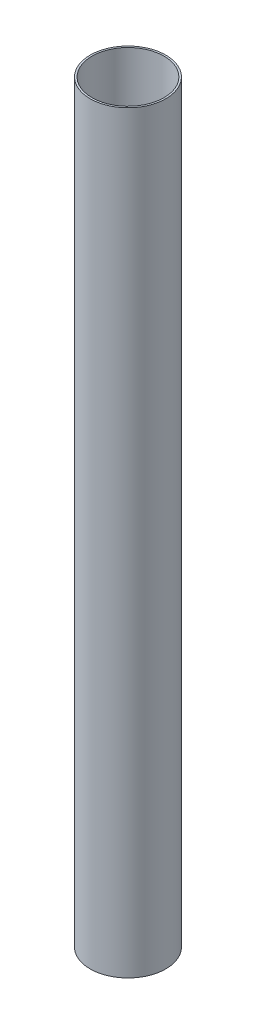
ISO-10303-21;
HEADER;
FILE_DESCRIPTION(('STEP AP214'),'2;1');
FILE_NAME('part.step','',(''),(''),'','','');
FILE_SCHEMA(('AUTOMOTIVE_DESIGN { 1 0 10303 214 1 1 1 1 }'));
ENDSEC;
DATA;
#1=APPLICATION_CONTEXT('core data for automotive mechanical design processes');
#2=APPLICATION_PROTOCOL_DEFINITION('international standard','automotive_design',2000,#1);
#3=PRODUCT_CONTEXT('',#1,'mechanical');
#4=PRODUCT('Part','Part','',(#3));
#5=PRODUCT_RELATED_PRODUCT_CATEGORY('part','',(#4));
#6=PRODUCT_DEFINITION_FORMATION('','',#4);
#7=PRODUCT_DEFINITION_CONTEXT('part definition',#1,'design');
#8=PRODUCT_DEFINITION('design','',#6,#7);
#9=PRODUCT_DEFINITION_SHAPE('','',#8);
#10=(LENGTH_UNIT() NAMED_UNIT(*) SI_UNIT(.MILLI.,.METRE.));
#11=(NAMED_UNIT(*) PLANE_ANGLE_UNIT() SI_UNIT($,.RADIAN.));
#12=(NAMED_UNIT(*) SI_UNIT($,.STERADIAN.) SOLID_ANGLE_UNIT());
#13=UNCERTAINTY_MEASURE_WITH_UNIT(LENGTH_MEASURE(1.E-05),#10,'distance_accuracy_value','');
#14=(GEOMETRIC_REPRESENTATION_CONTEXT(3) GLOBAL_UNCERTAINTY_ASSIGNED_CONTEXT((#13)) GLOBAL_UNIT_ASSIGNED_CONTEXT((#10,
#11,#12)) REPRESENTATION_CONTEXT('',''));
#15=CARTESIAN_POINT('',(0.,0.,0.));
#16=DIRECTION('',(0.,0.,1.));
#17=DIRECTION('',(1.,0.,0.));
#18=AXIS2_PLACEMENT_3D('',#15,#16,#17);
#19=CARTESIAN_POINT('',(0.,500.,0.));
#20=DIRECTION('',(0.,1.,0.));
#21=DIRECTION('',(0.,0.,1.));
#22=AXIS2_PLACEMENT_3D('',#19,#20,#21);
#23=PLANE('',#22);
#24=CARTESIAN_POINT('',(0.,500.,0.));
#25=DIRECTION('',(0.,1.,0.));
#26=DIRECTION('',(0.,0.,1.));
#27=AXIS2_PLACEMENT_3D('',#24,#25,#26);
#28=CIRCLE('',#27,25.1);
#29=CARTESIAN_POINT('',(0.,500.,25.1));
#30=VERTEX_POINT('',#29);
#31=EDGE_CURVE('E10',#30,#30,#28,.T.);
#32=ORIENTED_EDGE('',*,*,#31,.T.);
#33=EDGE_LOOP('',(#32));
#34=FACE_BOUND('',#33,.T.);
#35=CARTESIAN_POINT('',(0.,500.,0.));
#36=DIRECTION('',(0.,1.,0.));
#37=DIRECTION('',(0.,0.,1.));
#38=AXIS2_PLACEMENT_3D('',#35,#36,#37);
#39=CIRCLE('',#38,23.9);
#40=CARTESIAN_POINT('',(0.,500.,23.9));
#41=VERTEX_POINT('',#40);
#42=EDGE_CURVE('E54',#41,#41,#39,.T.);
#43=ORIENTED_EDGE('',*,*,#42,.F.);
#44=EDGE_LOOP('',(#43));
#45=FACE_BOUND('',#44,.T.);
#46=ADVANCED_FACE('F41',(#34,#45),#23,.T.);
#47=CARTESIAN_POINT('',(0.,0.,0.));
#48=DIRECTION('',(0.,1.,0.));
#49=DIRECTION('',(0.,0.,1.));
#50=AXIS2_PLACEMENT_3D('',#47,#48,#49);
#51=PLANE('',#50);
#52=CARTESIAN_POINT('',(0.,0.,0.));
#53=DIRECTION('',(0.,1.,0.));
#54=DIRECTION('',(0.,0.,1.));
#55=AXIS2_PLACEMENT_3D('',#52,#53,#54);
#56=CIRCLE('',#55,25.1);
#57=CARTESIAN_POINT('',(0.,0.,25.1));
#58=VERTEX_POINT('',#57);
#59=EDGE_CURVE('E45',#58,#58,#56,.T.);
#60=ORIENTED_EDGE('',*,*,#59,.F.);
#61=EDGE_LOOP('',(#60));
#62=FACE_BOUND('',#61,.T.);
#63=CARTESIAN_POINT('',(0.,0.,0.));
#64=DIRECTION('',(0.,1.,0.));
#65=DIRECTION('',(0.,0.,1.));
#66=AXIS2_PLACEMENT_3D('',#63,#64,#65);
#67=CIRCLE('',#66,23.9);
#68=CARTESIAN_POINT('',(0.,0.,23.9));
#69=VERTEX_POINT('',#68);
#70=EDGE_CURVE('E56',#69,#69,#67,.T.);
#71=ORIENTED_EDGE('',*,*,#70,.T.);
#72=EDGE_LOOP('',(#71));
#73=FACE_BOUND('',#72,.T.);
#74=ADVANCED_FACE('F68',(#62,#73),#51,.F.);
#75=CARTESIAN_POINT('',(0.,500.,0.));
#76=DIRECTION('',(0.,-1.,0.));
#77=DIRECTION('',(0.,0.,-1.));
#78=AXIS2_PLACEMENT_3D('',#75,#76,#77);
#79=CYLINDRICAL_SURFACE('',#78,25.1);
#80=ORIENTED_EDGE('',*,*,#31,.F.);
#81=EDGE_LOOP('',(#80));
#82=FACE_BOUND('',#81,.T.);
#83=ORIENTED_EDGE('',*,*,#59,.T.);
#84=EDGE_LOOP('',(#83));
#85=FACE_BOUND('',#84,.T.);
#86=ADVANCED_FACE('F43',(#82,#85),#79,.T.);
#87=CARTESIAN_POINT('',(0.,500.,0.));
#88=DIRECTION('',(0.,-1.,0.));
#89=DIRECTION('',(0.,0.,-1.));
#90=AXIS2_PLACEMENT_3D('',#87,#88,#89);
#91=CYLINDRICAL_SURFACE('',#90,23.9);
#92=ORIENTED_EDGE('',*,*,#42,.T.);
#93=EDGE_LOOP('',(#92));
#94=FACE_BOUND('',#93,.T.);
#95=ORIENTED_EDGE('',*,*,#70,.F.);
#96=EDGE_LOOP('',(#95));
#97=FACE_BOUND('',#96,.T.);
#98=ADVANCED_FACE('F64',(#94,#97),#91,.F.);
#99=CLOSED_SHELL('',(#46,#74,#86,#98));
#100=MANIFOLD_SOLID_BREP('B2',#99);
#101=ADVANCED_BREP_SHAPE_REPRESENTATION('',(#18,#100),#14);
#102=SHAPE_DEFINITION_REPRESENTATION(#9,#101);
ENDSEC;
END-ISO-10303-21;
